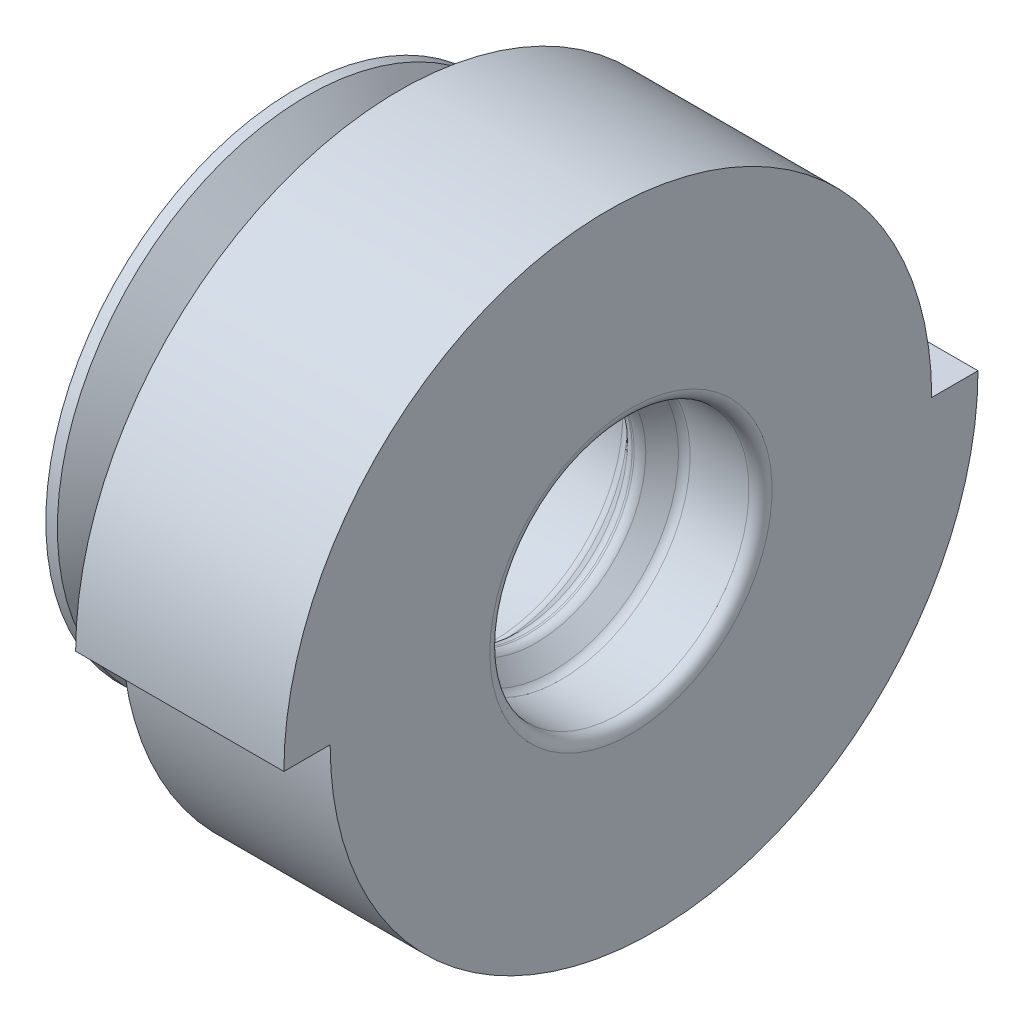
ISO-10303-21;
HEADER;
FILE_DESCRIPTION(('STEP AP214'),'2;1');
FILE_NAME('part.step','',(''),(''),'','','');
FILE_SCHEMA(('AUTOMOTIVE_DESIGN { 1 0 10303 214 1 1 1 1 }'));
ENDSEC;
DATA;
#1=APPLICATION_CONTEXT('core data for automotive mechanical design processes');
#2=APPLICATION_PROTOCOL_DEFINITION('international standard','automotive_design',2000,#1);
#3=PRODUCT_CONTEXT('',#1,'mechanical');
#4=PRODUCT('Part','Part','',(#3));
#5=PRODUCT_RELATED_PRODUCT_CATEGORY('part','',(#4));
#6=PRODUCT_DEFINITION_FORMATION('','',#4);
#7=PRODUCT_DEFINITION_CONTEXT('part definition',#1,'design');
#8=PRODUCT_DEFINITION('design','',#6,#7);
#9=PRODUCT_DEFINITION_SHAPE('','',#8);
#10=(LENGTH_UNIT() NAMED_UNIT(*) SI_UNIT(.MILLI.,.METRE.));
#11=(NAMED_UNIT(*) PLANE_ANGLE_UNIT() SI_UNIT($,.RADIAN.));
#12=(NAMED_UNIT(*) SI_UNIT($,.STERADIAN.) SOLID_ANGLE_UNIT());
#13=UNCERTAINTY_MEASURE_WITH_UNIT(LENGTH_MEASURE(1.E-05),#10,'distance_accuracy_value','');
#14=(GEOMETRIC_REPRESENTATION_CONTEXT(3) GLOBAL_UNCERTAINTY_ASSIGNED_CONTEXT((#13)) GLOBAL_UNIT_ASSIGNED_CONTEXT((#10,
#11,#12)) REPRESENTATION_CONTEXT('',''));
#15=CARTESIAN_POINT('',(0.,0.,0.));
#16=DIRECTION('',(0.,0.,1.));
#17=DIRECTION('',(1.,0.,0.));
#18=AXIS2_PLACEMENT_3D('',#15,#16,#17);
#19=CARTESIAN_POINT('',(18.,0.,0.));
#20=DIRECTION('',(-1.,0.,0.));
#21=DIRECTION('',(0.,0.,1.));
#22=AXIS2_PLACEMENT_3D('',#19,#20,#21);
#23=CYLINDRICAL_SURFACE('',#22,11.2);
#24=CARTESIAN_POINT('',(6.08578643762691,0.,0.));
#25=DIRECTION('',(-1.,0.,0.));
#26=DIRECTION('',(0.,0.,1.));
#27=AXIS2_PLACEMENT_3D('',#24,#25,#26);
#28=CIRCLE('',#27,11.2);
#29=CARTESIAN_POINT('',(6.08578643762691,0.,11.2));
#30=VERTEX_POINT('',#29);
#31=EDGE_CURVE('E11',#30,#30,#28,.F.);
#32=ORIENTED_EDGE('',*,*,#31,.T.);
#33=EDGE_LOOP('',(#32));
#34=FACE_BOUND('',#33,.T.);
#35=CARTESIAN_POINT('',(0.268990774522655,0.,0.));
#36=DIRECTION('',(-1.,0.,0.));
#37=DIRECTION('',(0.,0.,1.));
#38=AXIS2_PLACEMENT_3D('',#35,#36,#37);
#39=CIRCLE('',#38,11.2);
#40=CARTESIAN_POINT('',(0.268990774522655,0.,11.2));
#41=VERTEX_POINT('',#40);
#42=EDGE_CURVE('E41',#41,#41,#39,.T.);
#43=ORIENTED_EDGE('',*,*,#42,.T.);
#44=EDGE_LOOP('',(#43));
#45=FACE_BOUND('',#44,.T.);
#46=ADVANCED_FACE('F32',(#34,#45),#23,.F.);
#47=CARTESIAN_POINT('',(11.9142135623731,0.,0.));
#48=DIRECTION('',(-1.,0.,0.));
#49=DIRECTION('',(0.,0.,1.));
#50=AXIS2_PLACEMENT_3D('',#47,#48,#49);
#51=CIRCLE('',#50,11.2);
#52=CARTESIAN_POINT('',(11.9142135623731,0.,11.2));
#53=VERTEX_POINT('',#52);
#54=EDGE_CURVE('E128',#53,#53,#51,.T.);
#55=ORIENTED_EDGE('',*,*,#54,.T.);
#56=EDGE_LOOP('',(#55));
#57=FACE_BOUND('',#56,.T.);
#58=CARTESIAN_POINT('',(17.,0.,0.));
#59=DIRECTION('',(-1.,0.,0.));
#60=DIRECTION('',(0.,0.,1.));
#61=AXIS2_PLACEMENT_3D('',#58,#59,#60);
#62=CIRCLE('',#61,11.2);
#63=CARTESIAN_POINT('',(17.,0.,11.2));
#64=VERTEX_POINT('',#63);
#65=EDGE_CURVE('E125',#64,#64,#62,.F.);
#66=ORIENTED_EDGE('',*,*,#65,.T.);
#67=EDGE_LOOP('',(#66));
#68=FACE_BOUND('',#67,.T.);
#69=ADVANCED_FACE('F174',(#57,#68),#23,.F.);
#70=CARTESIAN_POINT('',(18.,0.,-2.));
#71=DIRECTION('',(-1.,0.,0.));
#72=DIRECTION('',(0.,0.,1.));
#73=AXIS2_PLACEMENT_3D('',#70,#71,#72);
#74=PLANE('',#73);
#75=CARTESIAN_POINT('',(18.,0.,0.));
#76=DIRECTION('',(-1.,0.,0.));
#77=DIRECTION('',(0.,0.,1.));
#78=AXIS2_PLACEMENT_3D('',#75,#76,#77);
#79=CIRCLE('',#78,12.2);
#80=CARTESIAN_POINT('',(18.,0.,12.2));
#81=VERTEX_POINT('',#80);
#82=EDGE_CURVE('E146',#81,#81,#79,.T.);
#83=ORIENTED_EDGE('',*,*,#82,.T.);
#84=EDGE_LOOP('',(#83));
#85=FACE_BOUND('',#84,.T.);
#86=CARTESIAN_POINT('',(18.,0.,-2.));
#87=DIRECTION('',(1.,0.,0.));
#88=DIRECTION('',(0.,0.,1.));
#89=AXIS2_PLACEMENT_3D('',#86,#87,#88);
#90=CIRCLE('',#89,28.);
#91=CARTESIAN_POINT('',(18.,0.,26.));
#92=VERTEX_POINT('',#91);
#93=CARTESIAN_POINT('',(18.,0.,-30.));
#94=VERTEX_POINT('',#93);
#95=EDGE_CURVE('E85',#92,#94,#90,.T.);
#96=ORIENTED_EDGE('',*,*,#95,.T.);
#97=DIRECTION('',(0.,0.,1.));
#98=VECTOR('',#97,1.);
#99=CARTESIAN_POINT('',(18.,0.,-26.));
#100=LINE('',#99,#98);
#101=CARTESIAN_POINT('',(18.,0.,-26.));
#102=VERTEX_POINT('',#101);
#103=EDGE_CURVE('E80',#94,#102,#100,.T.);
#104=ORIENTED_EDGE('',*,*,#103,.T.);
#105=CARTESIAN_POINT('',(18.,0.,2.));
#106=DIRECTION('',(1.,0.,0.));
#107=DIRECTION('',(0.,0.,1.));
#108=AXIS2_PLACEMENT_3D('',#105,#106,#107);
#109=CIRCLE('',#108,28.);
#110=CARTESIAN_POINT('',(18.,0.,30.));
#111=VERTEX_POINT('',#110);
#112=EDGE_CURVE('E83',#102,#111,#109,.T.);
#113=ORIENTED_EDGE('',*,*,#112,.T.);
#114=DIRECTION('',(0.,0.,-1.));
#115=VECTOR('',#114,1.);
#116=CARTESIAN_POINT('',(18.,0.,26.));
#117=LINE('',#116,#115);
#118=EDGE_CURVE('E49',#111,#92,#117,.T.);
#119=ORIENTED_EDGE('',*,*,#118,.T.);
#120=EDGE_LOOP('',(#96,#104,#113,#119));
#121=FACE_BOUND('',#120,.T.);
#122=ADVANCED_FACE('F81',(#85,#121),#74,.F.);
#123=CARTESIAN_POINT('',(0.,0.,-2.));
#124=DIRECTION('',(-1.,0.,0.));
#125=DIRECTION('',(0.,0.,1.));
#126=AXIS2_PLACEMENT_3D('',#123,#124,#125);
#127=PLANE('',#126);
#128=CARTESIAN_POINT('',(0.,0.,0.));
#129=DIRECTION('',(-1.,0.,0.));
#130=DIRECTION('',(0.,0.,1.));
#131=AXIS2_PLACEMENT_3D('',#128,#129,#130);
#132=CIRCLE('',#131,21.5793839814855);
#133=CARTESIAN_POINT('',(0.,0.,21.5793839814855));
#134=VERTEX_POINT('',#133);
#135=EDGE_CURVE('E110',#134,#134,#132,.T.);
#136=ORIENTED_EDGE('',*,*,#135,.F.);
#137=EDGE_LOOP('',(#136));
#138=FACE_BOUND('',#137,.T.);
#139=CARTESIAN_POINT('',(0.,0.,-2.));
#140=DIRECTION('',(1.,0.,0.));
#141=DIRECTION('',(0.,0.,1.));
#142=AXIS2_PLACEMENT_3D('',#139,#140,#141);
#143=CIRCLE('',#142,28.);
#144=CARTESIAN_POINT('',(0.,0.,26.));
#145=VERTEX_POINT('',#144);
#146=CARTESIAN_POINT('',(0.,0.,-30.));
#147=VERTEX_POINT('',#146);
#148=EDGE_CURVE('E100',#145,#147,#143,.T.);
#149=ORIENTED_EDGE('',*,*,#148,.F.);
#150=DIRECTION('',(0.,0.,-1.));
#151=VECTOR('',#150,1.);
#152=CARTESIAN_POINT('',(0.,0.,26.));
#153=LINE('',#152,#151);
#154=CARTESIAN_POINT('',(0.,0.,30.));
#155=VERTEX_POINT('',#154);
#156=EDGE_CURVE('E72',#155,#145,#153,.T.);
#157=ORIENTED_EDGE('',*,*,#156,.F.);
#158=CARTESIAN_POINT('',(0.,0.,2.));
#159=DIRECTION('',(1.,0.,0.));
#160=DIRECTION('',(0.,0.,1.));
#161=AXIS2_PLACEMENT_3D('',#158,#159,#160);
#162=CIRCLE('',#161,28.);
#163=CARTESIAN_POINT('',(0.,0.,-26.));
#164=VERTEX_POINT('',#163);
#165=EDGE_CURVE('E66',#164,#155,#162,.T.);
#166=ORIENTED_EDGE('',*,*,#165,.F.);
#167=DIRECTION('',(0.,0.,1.));
#168=VECTOR('',#167,1.);
#169=CARTESIAN_POINT('',(0.,0.,-26.));
#170=LINE('',#169,#168);
#171=EDGE_CURVE('E90',#147,#164,#170,.T.);
#172=ORIENTED_EDGE('',*,*,#171,.F.);
#173=EDGE_LOOP('',(#149,#157,#166,#172));
#174=FACE_BOUND('',#173,.T.);
#175=ADVANCED_FACE('F187',(#138,#174),#127,.T.);
#176=CARTESIAN_POINT('',(18.,0.,-2.));
#177=DIRECTION('',(-1.,0.,0.));
#178=DIRECTION('',(0.,0.,1.));
#179=AXIS2_PLACEMENT_3D('',#176,#177,#178);
#180=CYLINDRICAL_SURFACE('',#179,28.);
#181=ORIENTED_EDGE('',*,*,#148,.T.);
#182=DIRECTION('',(-1.,0.,0.));
#183=VECTOR('',#182,1.);
#184=CARTESIAN_POINT('',(18.,0.,-30.));
#185=LINE('',#184,#183);
#186=EDGE_CURVE('E91',#94,#147,#185,.T.);
#187=ORIENTED_EDGE('',*,*,#186,.F.);
#188=ORIENTED_EDGE('',*,*,#95,.F.);
#189=DIRECTION('',(-1.,0.,0.));
#190=VECTOR('',#189,1.);
#191=CARTESIAN_POINT('',(18.,0.,26.));
#192=LINE('',#191,#190);
#193=EDGE_CURVE('E96',#92,#145,#192,.T.);
#194=ORIENTED_EDGE('',*,*,#193,.T.);
#195=EDGE_LOOP('',(#181,#187,#188,#194));
#196=FACE_BOUND('',#195,.T.);
#197=ADVANCED_FACE('F191',(#196),#180,.T.);
#198=CARTESIAN_POINT('',(18.,0.,-26.));
#199=DIRECTION('',(0.,-1.,0.));
#200=DIRECTION('',(0.,0.,-1.));
#201=AXIS2_PLACEMENT_3D('',#198,#199,#200);
#202=PLANE('',#201);
#203=ORIENTED_EDGE('',*,*,#171,.T.);
#204=DIRECTION('',(-1.,0.,0.));
#205=VECTOR('',#204,1.);
#206=CARTESIAN_POINT('',(18.,0.,-26.));
#207=LINE('',#206,#205);
#208=EDGE_CURVE('E88',#102,#164,#207,.T.);
#209=ORIENTED_EDGE('',*,*,#208,.F.);
#210=ORIENTED_EDGE('',*,*,#103,.F.);
#211=ORIENTED_EDGE('',*,*,#186,.T.);
#212=EDGE_LOOP('',(#203,#209,#210,#211));
#213=FACE_BOUND('',#212,.T.);
#214=ADVANCED_FACE('F89',(#213),#202,.F.);
#215=CARTESIAN_POINT('',(18.,0.,2.));
#216=DIRECTION('',(-1.,0.,0.));
#217=DIRECTION('',(0.,0.,1.));
#218=AXIS2_PLACEMENT_3D('',#215,#216,#217);
#219=CYLINDRICAL_SURFACE('',#218,28.);
#220=ORIENTED_EDGE('',*,*,#165,.T.);
#221=DIRECTION('',(-1.,0.,0.));
#222=VECTOR('',#221,1.);
#223=CARTESIAN_POINT('',(18.,0.,30.));
#224=LINE('',#223,#222);
#225=EDGE_CURVE('E92',#111,#155,#224,.T.);
#226=ORIENTED_EDGE('',*,*,#225,.F.);
#227=ORIENTED_EDGE('',*,*,#112,.F.);
#228=ORIENTED_EDGE('',*,*,#208,.T.);
#229=EDGE_LOOP('',(#220,#226,#227,#228));
#230=FACE_BOUND('',#229,.T.);
#231=ADVANCED_FACE('F94',(#230),#219,.T.);
#232=CARTESIAN_POINT('',(18.,0.,26.));
#233=DIRECTION('',(0.,1.,0.));
#234=DIRECTION('',(0.,0.,1.));
#235=AXIS2_PLACEMENT_3D('',#232,#233,#234);
#236=PLANE('',#235);
#237=ORIENTED_EDGE('',*,*,#156,.T.);
#238=ORIENTED_EDGE('',*,*,#193,.F.);
#239=ORIENTED_EDGE('',*,*,#118,.F.);
#240=ORIENTED_EDGE('',*,*,#225,.T.);
#241=EDGE_LOOP('',(#237,#238,#239,#240));
#242=FACE_BOUND('',#241,.T.);
#243=ADVANCED_FACE('F193',(#242),#236,.F.);
#244=CARTESIAN_POINT('',(0.,0.,0.));
#245=DIRECTION('',(1.,0.,0.));
#246=DIRECTION('',(0.,0.,-1.));
#247=AXIS2_PLACEMENT_3D('',#244,#245,#246);
#248=CYLINDRICAL_SURFACE('',#247,21.5793839814855);
#249=CARTESIAN_POINT('',(-1.,0.,0.));
#250=DIRECTION('',(1.,0.,0.));
#251=DIRECTION('',(0.,0.,-1.));
#252=AXIS2_PLACEMENT_3D('',#249,#250,#251);
#253=CIRCLE('',#252,21.5793839814855);
#254=CARTESIAN_POINT('',(-1.,0.,-21.5793839814855));
#255=VERTEX_POINT('',#254);
#256=EDGE_CURVE('E103',#255,#255,#253,.T.);
#257=ORIENTED_EDGE('',*,*,#256,.T.);
#258=EDGE_LOOP('',(#257));
#259=FACE_BOUND('',#258,.T.);
#260=ORIENTED_EDGE('',*,*,#135,.T.);
#261=EDGE_LOOP('',(#260));
#262=FACE_BOUND('',#261,.T.);
#263=ADVANCED_FACE('F183',(#259,#262),#248,.T.);
#264=CARTESIAN_POINT('',(-1.,0.,-21.5793839814855));
#265=DIRECTION('',(-1.,0.,0.));
#266=DIRECTION('',(0.,0.,1.));
#267=AXIS2_PLACEMENT_3D('',#264,#265,#266);
#268=PLANE('',#267);
#269=CARTESIAN_POINT('',(-1.,0.,0.));
#270=DIRECTION('',(1.,0.,0.));
#271=DIRECTION('',(0.,0.,-1.));
#272=AXIS2_PLACEMENT_3D('',#269,#270,#271);
#273=CIRCLE('',#272,18.6);
#274=CARTESIAN_POINT('',(-1.,0.,-18.6));
#275=VERTEX_POINT('',#274);
#276=EDGE_CURVE('E398',#275,#275,#273,.T.);
#277=ORIENTED_EDGE('',*,*,#276,.T.);
#278=EDGE_LOOP('',(#277));
#279=FACE_BOUND('',#278,.T.);
#280=ORIENTED_EDGE('',*,*,#256,.F.);
#281=EDGE_LOOP('',(#280));
#282=FACE_BOUND('',#281,.T.);
#283=ADVANCED_FACE('F331',(#279,#282),#268,.T.);
#284=CARTESIAN_POINT('',(0.,0.,0.));
#285=DIRECTION('',(1.,0.,0.));
#286=DIRECTION('',(0.,0.,-1.));
#287=AXIS2_PLACEMENT_3D('',#284,#285,#286);
#288=CYLINDRICAL_SURFACE('',#287,18.6);
#289=CARTESIAN_POINT('',(-7.49999999999999,0.,0.));
#290=DIRECTION('',(1.,0.,0.));
#291=DIRECTION('',(0.,0.,-1.));
#292=AXIS2_PLACEMENT_3D('',#289,#290,#291);
#293=CIRCLE('',#292,18.6);
#294=CARTESIAN_POINT('',(-7.49999999999999,0.,-18.6));
#295=VERTEX_POINT('',#294);
#296=EDGE_CURVE('E401',#295,#295,#293,.T.);
#297=ORIENTED_EDGE('',*,*,#296,.T.);
#298=EDGE_LOOP('',(#297));
#299=FACE_BOUND('',#298,.T.);
#300=ORIENTED_EDGE('',*,*,#276,.F.);
#301=EDGE_LOOP('',(#300));
#302=FACE_BOUND('',#301,.T.);
#303=ADVANCED_FACE('F322',(#299,#302),#288,.T.);
#304=CARTESIAN_POINT('',(-7.49999999999999,0.,0.));
#305=DIRECTION('',(-1.,0.,0.));
#306=DIRECTION('',(0.,0.,1.));
#307=AXIS2_PLACEMENT_3D('',#304,#305,#306);
#308=CONICAL_SURFACE('',#307,18.6,0.872664625997165);
#309=CARTESIAN_POINT('',(-10.,0.,0.));
#310=DIRECTION('',(1.,0.,0.));
#311=DIRECTION('',(0.,0.,-1.));
#312=AXIS2_PLACEMENT_3D('',#309,#310,#311);
#313=CIRCLE('',#312,21.5793839814855);
#314=CARTESIAN_POINT('',(-10.,0.,-21.5793839814855));
#315=VERTEX_POINT('',#314);
#316=EDGE_CURVE('E404',#315,#315,#313,.T.);
#317=ORIENTED_EDGE('',*,*,#316,.T.);
#318=EDGE_LOOP('',(#317));
#319=FACE_BOUND('',#318,.T.);
#320=ORIENTED_EDGE('',*,*,#296,.F.);
#321=EDGE_LOOP('',(#320));
#322=FACE_BOUND('',#321,.T.);
#323=ADVANCED_FACE('F313',(#319,#322),#308,.T.);
#324=CARTESIAN_POINT('',(0.,0.,0.));
#325=DIRECTION('',(1.,0.,0.));
#326=DIRECTION('',(0.,0.,-1.));
#327=AXIS2_PLACEMENT_3D('',#324,#325,#326);
#328=CYLINDRICAL_SURFACE('',#327,21.5793839814855);
#329=CARTESIAN_POINT('',(-11.,0.,0.));
#330=DIRECTION('',(1.,0.,0.));
#331=DIRECTION('',(0.,0.,-1.));
#332=AXIS2_PLACEMENT_3D('',#329,#330,#331);
#333=CIRCLE('',#332,21.5793839814855);
#334=CARTESIAN_POINT('',(-11.,0.,-21.5793839814855));
#335=VERTEX_POINT('',#334);
#336=EDGE_CURVE('E407',#335,#335,#333,.T.);
#337=ORIENTED_EDGE('',*,*,#336,.T.);
#338=EDGE_LOOP('',(#337));
#339=FACE_BOUND('',#338,.T.);
#340=ORIENTED_EDGE('',*,*,#316,.F.);
#341=EDGE_LOOP('',(#340));
#342=FACE_BOUND('',#341,.T.);
#343=ADVANCED_FACE('F170',(#339,#342),#328,.T.);
#344=CARTESIAN_POINT('',(-11.,0.,-21.5793839814855));
#345=DIRECTION('',(-1.,0.,0.));
#346=DIRECTION('',(0.,0.,1.));
#347=AXIS2_PLACEMENT_3D('',#344,#345,#346);
#348=PLANE('',#347);
#349=CARTESIAN_POINT('',(-11.,0.,0.));
#350=DIRECTION('',(-1.,0.,0.));
#351=DIRECTION('',(0.,0.,1.));
#352=AXIS2_PLACEMENT_3D('',#349,#350,#351);
#353=CIRCLE('',#352,18.1554395684557);
#354=CARTESIAN_POINT('',(-11.,0.,18.1554395684557));
#355=VERTEX_POINT('',#354);
#356=EDGE_CURVE('E131',#355,#355,#353,.F.);
#357=ORIENTED_EDGE('',*,*,#356,.T.);
#358=EDGE_LOOP('',(#357));
#359=FACE_BOUND('',#358,.T.);
#360=ORIENTED_EDGE('',*,*,#336,.F.);
#361=EDGE_LOOP('',(#360));
#362=FACE_BOUND('',#361,.T.);
#363=ADVANCED_FACE('F160',(#359,#362),#348,.T.);
#364=CARTESIAN_POINT('',(-11.,0.,0.));
#365=DIRECTION('',(-1.,0.,0.));
#366=DIRECTION('',(0.,0.,1.));
#367=AXIS2_PLACEMENT_3D('',#364,#365,#366);
#368=CONICAL_SURFACE('',#367,17.5793839814855,0.525541887651996);
#369=CARTESIAN_POINT('',(-10.5016818394211,0.,0.));
#370=DIRECTION('',(1.,0.,0.));
#371=DIRECTION('',(0.,0.,-1.));
#372=AXIS2_PLACEMENT_3D('',#369,#370,#371);
#373=CIRCLE('',#372,17.2903873550055);
#374=CARTESIAN_POINT('',(-10.5016818394211,0.,-17.2903873550055));
#375=VERTEX_POINT('',#374);
#376=EDGE_CURVE('E137',#375,#375,#373,.F.);
#377=ORIENTED_EDGE('',*,*,#376,.T.);
#378=EDGE_LOOP('',(#377));
#379=FACE_BOUND('',#378,.T.);
#380=CARTESIAN_POINT('',(-0.232691064898486,0.,0.));
#381=DIRECTION('',(1.,0.,0.));
#382=DIRECTION('',(0.,0.,-1.));
#383=AXIS2_PLACEMENT_3D('',#380,#381,#382);
#384=CIRCLE('',#383,11.3349477865498);
#385=CARTESIAN_POINT('',(-0.232691064898486,0.,-11.3349477865498));
#386=VERTEX_POINT('',#385);
#387=EDGE_CURVE('E134',#386,#386,#384,.T.);
#388=ORIENTED_EDGE('',*,*,#387,.T.);
#389=EDGE_LOOP('',(#388));
#390=FACE_BOUND('',#389,.T.);
#391=ADVANCED_FACE('F157',(#379,#390),#368,.F.);
#392=CARTESIAN_POINT('',(6.5,0.,0.));
#393=DIRECTION('',(-1.,0.,0.));
#394=DIRECTION('',(0.,0.,1.));
#395=AXIS2_PLACEMENT_3D('',#392,#393,#394);
#396=CONICAL_SURFACE('',#395,11.2,0.785398163397443);
#397=CARTESIAN_POINT('',(8.20710678118658,0.,0.));
#398=DIRECTION('',(1.,0.,0.));
#399=DIRECTION('',(0.,0.,-1.));
#400=AXIS2_PLACEMENT_3D('',#397,#398,#399);
#401=CIRCLE('',#400,9.49289321881345);
#402=CARTESIAN_POINT('',(8.20710678118658,0.,-9.49289321881345));
#403=VERTEX_POINT('',#402);
#404=EDGE_CURVE('E143',#403,#403,#401,.T.);
#405=ORIENTED_EDGE('',*,*,#404,.T.);
#406=EDGE_LOOP('',(#405));
#407=FACE_BOUND('',#406,.T.);
#408=CARTESIAN_POINT('',(6.79289321881345,0.,0.));
#409=DIRECTION('',(1.,0.,0.));
#410=DIRECTION('',(0.,0.,-1.));
#411=AXIS2_PLACEMENT_3D('',#408,#409,#410);
#412=CIRCLE('',#411,10.9071067811866);
#413=CARTESIAN_POINT('',(6.79289321881345,0.,-10.9071067811866));
#414=VERTEX_POINT('',#413);
#415=EDGE_CURVE('E140',#414,#414,#412,.F.);
#416=ORIENTED_EDGE('',*,*,#415,.T.);
#417=EDGE_LOOP('',(#416));
#418=FACE_BOUND('',#417,.T.);
#419=ADVANCED_FACE('F159',(#407,#418),#396,.F.);
#420=CARTESIAN_POINT('',(0.,0.,0.));
#421=DIRECTION('',(-1.,0.,0.));
#422=DIRECTION('',(0.,0.,1.));
#423=AXIS2_PLACEMENT_3D('',#420,#421,#422);
#424=CYLINDRICAL_SURFACE('',#423,9.2);
#425=CARTESIAN_POINT('',(9.08578643762688,0.,0.));
#426=DIRECTION('',(1.,0.,0.));
#427=DIRECTION('',(0.,0.,-1.));
#428=AXIS2_PLACEMENT_3D('',#425,#426,#427);
#429=CIRCLE('',#428,9.2);
#430=CARTESIAN_POINT('',(9.08578643762688,0.,-9.2));
#431=VERTEX_POINT('',#430);
#432=EDGE_CURVE('E122',#431,#431,#429,.T.);
#433=ORIENTED_EDGE('',*,*,#432,.T.);
#434=EDGE_LOOP('',(#433));
#435=FACE_BOUND('',#434,.T.);
#436=CARTESIAN_POINT('',(8.91421356237312,0.,0.));
#437=DIRECTION('',(1.,0.,0.));
#438=DIRECTION('',(0.,0.,-1.));
#439=AXIS2_PLACEMENT_3D('',#436,#437,#438);
#440=CIRCLE('',#439,9.2);
#441=CARTESIAN_POINT('',(8.91421356237312,0.,-9.2));
#442=VERTEX_POINT('',#441);
#443=EDGE_CURVE('E119',#442,#442,#440,.F.);
#444=ORIENTED_EDGE('',*,*,#443,.T.);
#445=EDGE_LOOP('',(#444));
#446=FACE_BOUND('',#445,.T.);
#447=ADVANCED_FACE('F167',(#435,#446),#424,.F.);
#448=CARTESIAN_POINT('',(9.49999999999997,0.,0.));
#449=DIRECTION('',(1.,0.,0.));
#450=DIRECTION('',(0.,0.,-1.));
#451=AXIS2_PLACEMENT_3D('',#448,#449,#450);
#452=CONICAL_SURFACE('',#451,9.2,0.785398163397443);
#453=CARTESIAN_POINT('',(9.79289321881343,0.,0.));
#454=DIRECTION('',(-1.,0.,0.));
#455=DIRECTION('',(0.,0.,1.));
#456=AXIS2_PLACEMENT_3D('',#453,#454,#455);
#457=CIRCLE('',#456,9.49289321881345);
#458=CARTESIAN_POINT('',(9.79289321881343,0.,9.49289321881345));
#459=VERTEX_POINT('',#458);
#460=EDGE_CURVE('E116',#459,#459,#457,.T.);
#461=ORIENTED_EDGE('',*,*,#460,.T.);
#462=EDGE_LOOP('',(#461));
#463=FACE_BOUND('',#462,.T.);
#464=CARTESIAN_POINT('',(11.2071067811865,0.,0.));
#465=DIRECTION('',(-1.,0.,0.));
#466=DIRECTION('',(0.,0.,1.));
#467=AXIS2_PLACEMENT_3D('',#464,#465,#466);
#468=CIRCLE('',#467,10.9071067811866);
#469=CARTESIAN_POINT('',(11.2071067811865,0.,10.9071067811866));
#470=VERTEX_POINT('',#469);
#471=EDGE_CURVE('E113',#470,#470,#468,.F.);
#472=ORIENTED_EDGE('',*,*,#471,.T.);
#473=EDGE_LOOP('',(#472));
#474=FACE_BOUND('',#473,.T.);
#475=ADVANCED_FACE('F207',(#463,#474),#452,.F.);
#476=CARTESIAN_POINT('',(9.08578643762688,0.,0.));
#477=DIRECTION('',(1.,0.,0.));
#478=DIRECTION('',(0.,0.,-1.));
#479=AXIS2_PLACEMENT_3D('',#476,#477,#478);
#480=TOROIDAL_SURFACE('',#479,10.2,1.);
#481=ORIENTED_EDGE('',*,*,#432,.F.);
#482=EDGE_LOOP('',(#481));
#483=FACE_BOUND('',#482,.T.);
#484=ORIENTED_EDGE('',*,*,#460,.F.);
#485=EDGE_LOOP('',(#484));
#486=FACE_BOUND('',#485,.T.);
#487=ADVANCED_FACE('F203',(#483,#486),#480,.T.);
#488=CARTESIAN_POINT('',(11.9142135623731,0.,0.));
#489=DIRECTION('',(-1.,0.,0.));
#490=DIRECTION('',(0.,0.,1.));
#491=AXIS2_PLACEMENT_3D('',#488,#489,#490);
#492=TOROIDAL_SURFACE('',#491,10.2,1.);
#493=ORIENTED_EDGE('',*,*,#471,.F.);
#494=EDGE_LOOP('',(#493));
#495=FACE_BOUND('',#494,.T.);
#496=ORIENTED_EDGE('',*,*,#54,.F.);
#497=EDGE_LOOP('',(#496));
#498=FACE_BOUND('',#497,.T.);
#499=ADVANCED_FACE('F206',(#495,#498),#492,.F.);
#500=CARTESIAN_POINT('',(-10.,0.,0.));
#501=DIRECTION('',(-1.,0.,0.));
#502=DIRECTION('',(0.,0.,1.));
#503=AXIS2_PLACEMENT_3D('',#500,#501,#502);
#504=TOROIDAL_SURFACE('',#503,18.1554395684557,1.);
#505=ORIENTED_EDGE('',*,*,#376,.F.);
#506=EDGE_LOOP('',(#505));
#507=FACE_BOUND('',#506,.T.);
#508=ORIENTED_EDGE('',*,*,#356,.F.);
#509=EDGE_LOOP('',(#508));
#510=FACE_BOUND('',#509,.T.);
#511=ADVANCED_FACE('F211',(#507,#510),#504,.T.);
#512=CARTESIAN_POINT('',(8.91421356237312,0.,0.));
#513=DIRECTION('',(1.,0.,0.));
#514=DIRECTION('',(0.,0.,-1.));
#515=AXIS2_PLACEMENT_3D('',#512,#513,#514);
#516=TOROIDAL_SURFACE('',#515,10.2,1.);
#517=ORIENTED_EDGE('',*,*,#404,.F.);
#518=EDGE_LOOP('',(#517));
#519=FACE_BOUND('',#518,.T.);
#520=ORIENTED_EDGE('',*,*,#443,.F.);
#521=EDGE_LOOP('',(#520));
#522=FACE_BOUND('',#521,.T.);
#523=ADVANCED_FACE('F215',(#519,#522),#516,.T.);
#524=CARTESIAN_POINT('',(17.,0.,0.));
#525=DIRECTION('',(-1.,0.,0.));
#526=DIRECTION('',(0.,0.,1.));
#527=AXIS2_PLACEMENT_3D('',#524,#525,#526);
#528=TOROIDAL_SURFACE('',#527,12.2,1.);
#529=ORIENTED_EDGE('',*,*,#82,.F.);
#530=EDGE_LOOP('',(#529));
#531=FACE_BOUND('',#530,.T.);
#532=ORIENTED_EDGE('',*,*,#65,.F.);
#533=EDGE_LOOP('',(#532));
#534=FACE_BOUND('',#533,.T.);
#535=ADVANCED_FACE('F219',(#531,#534),#528,.T.);
#536=CARTESIAN_POINT('',(6.08578643762691,0.,0.));
#537=DIRECTION('',(-1.,0.,0.));
#538=DIRECTION('',(0.,0.,1.));
#539=AXIS2_PLACEMENT_3D('',#536,#537,#538);
#540=TOROIDAL_SURFACE('',#539,10.2,1.);
#541=ORIENTED_EDGE('',*,*,#31,.F.);
#542=EDGE_LOOP('',(#541));
#543=FACE_BOUND('',#542,.T.);
#544=ORIENTED_EDGE('',*,*,#415,.F.);
#545=EDGE_LOOP('',(#544));
#546=FACE_BOUND('',#545,.T.);
#547=ADVANCED_FACE('F154',(#543,#546),#540,.F.);
#548=CARTESIAN_POINT('',(0.268990774522654,0.,0.));
#549=DIRECTION('',(-1.,0.,0.));
#550=DIRECTION('',(0.,0.,1.));
#551=AXIS2_PLACEMENT_3D('',#548,#549,#550);
#552=TOROIDAL_SURFACE('',#551,12.2,1.);
#553=ORIENTED_EDGE('',*,*,#42,.F.);
#554=EDGE_LOOP('',(#553));
#555=FACE_BOUND('',#554,.T.);
#556=ORIENTED_EDGE('',*,*,#387,.F.);
#557=EDGE_LOOP('',(#556));
#558=FACE_BOUND('',#557,.T.);
#559=ADVANCED_FACE('F34',(#555,#558),#552,.T.);
#560=CLOSED_SHELL('',(#46,#69,#122,#175,#197,#214,#231,#243,#263,#283,#303,#323,#343,#363,#391,
#419,#447,#475,#487,#499,#511,#523,#535,#547,#559));
#561=MANIFOLD_SOLID_BREP('B2',#560);
#562=ADVANCED_BREP_SHAPE_REPRESENTATION('',(#18,#561),#14);
#563=SHAPE_DEFINITION_REPRESENTATION(#9,#562);
ENDSEC;
END-ISO-10303-21;
